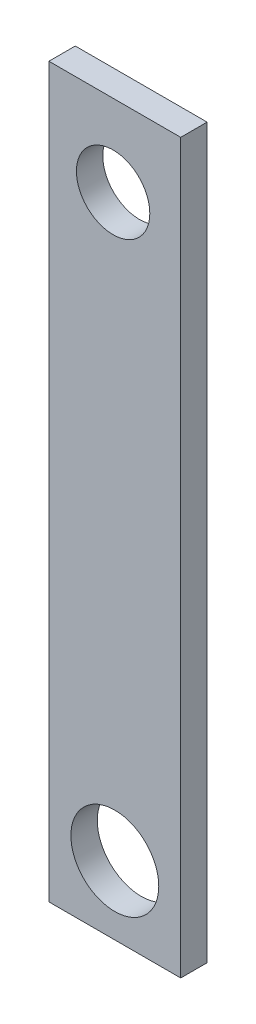
ISO-10303-21;
HEADER;
FILE_DESCRIPTION(('STEP AP214'),'2;1');
FILE_NAME('part.step','',(''),(''),'','','');
FILE_SCHEMA(('AUTOMOTIVE_DESIGN { 1 0 10303 214 1 1 1 1 }'));
ENDSEC;
DATA;
#1=APPLICATION_CONTEXT('core data for automotive mechanical design processes');
#2=APPLICATION_PROTOCOL_DEFINITION('international standard','automotive_design',2000,#1);
#3=PRODUCT_CONTEXT('',#1,'mechanical');
#4=PRODUCT('Part','Part','',(#3));
#5=PRODUCT_RELATED_PRODUCT_CATEGORY('part','',(#4));
#6=PRODUCT_DEFINITION_FORMATION('','',#4);
#7=PRODUCT_DEFINITION_CONTEXT('part definition',#1,'design');
#8=PRODUCT_DEFINITION('design','',#6,#7);
#9=PRODUCT_DEFINITION_SHAPE('','',#8);
#10=(LENGTH_UNIT() NAMED_UNIT(*) SI_UNIT(.MILLI.,.METRE.));
#11=(NAMED_UNIT(*) PLANE_ANGLE_UNIT() SI_UNIT($,.RADIAN.));
#12=(NAMED_UNIT(*) SI_UNIT($,.STERADIAN.) SOLID_ANGLE_UNIT());
#13=UNCERTAINTY_MEASURE_WITH_UNIT(LENGTH_MEASURE(1.E-05),#10,'distance_accuracy_value','');
#14=(GEOMETRIC_REPRESENTATION_CONTEXT(3) GLOBAL_UNCERTAINTY_ASSIGNED_CONTEXT((#13)) GLOBAL_UNIT_ASSIGNED_CONTEXT((#10,
#11,#12)) REPRESENTATION_CONTEXT('',''));
#15=CARTESIAN_POINT('',(0.,0.,0.));
#16=DIRECTION('',(0.,0.,1.));
#17=DIRECTION('',(1.,0.,0.));
#18=AXIS2_PLACEMENT_3D('',#15,#16,#17);
#19=CARTESIAN_POINT('',(0.,0.,3.));
#20=DIRECTION('',(0.,0.,1.));
#21=DIRECTION('',(1.,0.,0.));
#22=AXIS2_PLACEMENT_3D('',#19,#20,#21);
#23=PLANE('',#22);
#24=CARTESIAN_POINT('',(-11.25,-27.5,3.));
#25=DIRECTION('',(0.,0.,1.));
#26=DIRECTION('',(1.,0.,0.));
#27=AXIS2_PLACEMENT_3D('',#24,#25,#26);
#28=CIRCLE('',#27,4.17686671267305);
#29=CARTESIAN_POINT('',(-7.07313328732693,-27.5,3.));
#30=VERTEX_POINT('',#29);
#31=EDGE_CURVE('E100',#30,#30,#28,.T.);
#32=ORIENTED_EDGE('',*,*,#31,.F.);
#33=EDGE_LOOP('',(#32));
#34=FACE_BOUND('',#33,.T.);
#35=DIRECTION('',(0.,-1.,0.));
#36=VECTOR('',#35,1.);
#37=CARTESIAN_POINT('',(-18.5554144467521,-18.2319581289414,3.));
#38=LINE('',#37,#36);
#39=CARTESIAN_POINT('',(-18.5554144467521,-18.2319581289414,3.));
#40=VERTEX_POINT('',#39);
#41=CARTESIAN_POINT('',(-18.5554144467521,-101.083085073858,3.));
#42=VERTEX_POINT('',#41);
#43=EDGE_CURVE('E85',#40,#42,#38,.T.);
#44=ORIENTED_EDGE('',*,*,#43,.T.);
#45=DIRECTION('',(1.,0.,0.));
#46=VECTOR('',#45,1.);
#47=CARTESIAN_POINT('',(-18.5554144467521,-101.083085073858,3.));
#48=LINE('',#47,#46);
#49=CARTESIAN_POINT('',(-3.55541444675214,-101.083085073858,3.));
#50=VERTEX_POINT('',#49);
#51=EDGE_CURVE('E80',#42,#50,#48,.T.);
#52=ORIENTED_EDGE('',*,*,#51,.T.);
#53=DIRECTION('',(0.,1.,0.));
#54=VECTOR('',#53,1.);
#55=CARTESIAN_POINT('',(-3.55541444675215,-18.2319581289414,3.));
#56=LINE('',#55,#54);
#57=CARTESIAN_POINT('',(-3.55541444675215,-18.2319581289414,3.));
#58=VERTEX_POINT('',#57);
#59=EDGE_CURVE('E83',#50,#58,#56,.T.);
#60=ORIENTED_EDGE('',*,*,#59,.T.);
#61=DIRECTION('',(-1.,0.,0.));
#62=VECTOR('',#61,1.);
#63=CARTESIAN_POINT('',(-18.5554144467521,-18.2319581289414,3.));
#64=LINE('',#63,#62);
#65=EDGE_CURVE('E50',#58,#40,#64,.T.);
#66=ORIENTED_EDGE('',*,*,#65,.T.);
#67=EDGE_LOOP('',(#44,#52,#60,#66));
#68=FACE_BOUND('',#67,.T.);
#69=CARTESIAN_POINT('',(-11.0554144467521,-93.2869434703163,3.));
#70=DIRECTION('',(0.,0.,1.));
#71=DIRECTION('',(1.,0.,0.));
#72=AXIS2_PLACEMENT_3D('',#69,#70,#71);
#73=CIRCLE('',#72,5.);
#74=CARTESIAN_POINT('',(-6.05541444675214,-93.2869434703163,3.));
#75=VERTEX_POINT('',#74);
#76=EDGE_CURVE('E115',#75,#75,#73,.T.);
#77=ORIENTED_EDGE('',*,*,#76,.F.);
#78=EDGE_LOOP('',(#77));
#79=FACE_BOUND('',#78,.T.);
#80=ADVANCED_FACE('F33',(#34,#68,#79),#23,.T.);
#81=CARTESIAN_POINT('',(0.,0.,0.));
#82=DIRECTION('',(0.,0.,1.));
#83=DIRECTION('',(1.,0.,0.));
#84=AXIS2_PLACEMENT_3D('',#81,#82,#83);
#85=PLANE('',#84);
#86=DIRECTION('',(0.,-1.,0.));
#87=VECTOR('',#86,1.);
#88=CARTESIAN_POINT('',(-18.5554144467521,-18.2319581289414,0.));
#89=LINE('',#88,#87);
#90=CARTESIAN_POINT('',(-18.5554144467521,-18.2319581289414,0.));
#91=VERTEX_POINT('',#90);
#92=CARTESIAN_POINT('',(-18.5554144467521,-101.083085073858,0.));
#93=VERTEX_POINT('',#92);
#94=EDGE_CURVE('E97',#91,#93,#89,.T.);
#95=ORIENTED_EDGE('',*,*,#94,.F.);
#96=DIRECTION('',(-1.,0.,0.));
#97=VECTOR('',#96,1.);
#98=CARTESIAN_POINT('',(-18.5554144467521,-18.2319581289414,0.));
#99=LINE('',#98,#97);
#100=CARTESIAN_POINT('',(-3.55541444675215,-18.2319581289414,0.));
#101=VERTEX_POINT('',#100);
#102=EDGE_CURVE('E73',#101,#91,#99,.T.);
#103=ORIENTED_EDGE('',*,*,#102,.F.);
#104=DIRECTION('',(0.,1.,0.));
#105=VECTOR('',#104,1.);
#106=CARTESIAN_POINT('',(-3.55541444675215,-18.2319581289414,0.));
#107=LINE('',#106,#105);
#108=CARTESIAN_POINT('',(-3.55541444675214,-101.083085073858,0.));
#109=VERTEX_POINT('',#108);
#110=EDGE_CURVE('E67',#109,#101,#107,.T.);
#111=ORIENTED_EDGE('',*,*,#110,.F.);
#112=DIRECTION('',(1.,0.,0.));
#113=VECTOR('',#112,1.);
#114=CARTESIAN_POINT('',(-18.5554144467521,-101.083085073858,0.));
#115=LINE('',#114,#113);
#116=EDGE_CURVE('E89',#93,#109,#115,.T.);
#117=ORIENTED_EDGE('',*,*,#116,.F.);
#118=EDGE_LOOP('',(#95,#103,#111,#117));
#119=FACE_BOUND('',#118,.T.);
#120=CARTESIAN_POINT('',(-11.25,-27.5,0.));
#121=DIRECTION('',(0.,0.,1.));
#122=DIRECTION('',(1.,0.,0.));
#123=AXIS2_PLACEMENT_3D('',#120,#121,#122);
#124=CIRCLE('',#123,4.17686671267305);
#125=CARTESIAN_POINT('',(-7.07313328732693,-27.5,0.));
#126=VERTEX_POINT('',#125);
#127=EDGE_CURVE('E112',#126,#126,#124,.T.);
#128=ORIENTED_EDGE('',*,*,#127,.T.);
#129=EDGE_LOOP('',(#128));
#130=FACE_BOUND('',#129,.T.);
#131=CARTESIAN_POINT('',(-11.0554144467521,-93.2869434703163,0.));
#132=DIRECTION('',(0.,0.,1.));
#133=DIRECTION('',(1.,0.,0.));
#134=AXIS2_PLACEMENT_3D('',#131,#132,#133);
#135=CIRCLE('',#134,5.);
#136=CARTESIAN_POINT('',(-6.05541444675214,-93.2869434703163,0.));
#137=VERTEX_POINT('',#136);
#138=EDGE_CURVE('E118',#137,#137,#135,.T.);
#139=ORIENTED_EDGE('',*,*,#138,.T.);
#140=EDGE_LOOP('',(#139));
#141=FACE_BOUND('',#140,.T.);
#142=ADVANCED_FACE('F108',(#119,#130,#141),#85,.F.);
#143=CARTESIAN_POINT('',(-18.5554144467521,-18.2319581289414,3.));
#144=DIRECTION('',(1.,0.,0.));
#145=DIRECTION('',(0.,0.,-1.));
#146=AXIS2_PLACEMENT_3D('',#143,#144,#145);
#147=PLANE('',#146);
#148=ORIENTED_EDGE('',*,*,#94,.T.);
#149=DIRECTION('',(0.,0.,-1.));
#150=VECTOR('',#149,1.);
#151=CARTESIAN_POINT('',(-18.5554144467521,-101.083085073858,3.));
#152=LINE('',#151,#150);
#153=EDGE_CURVE('E11',#42,#93,#152,.T.);
#154=ORIENTED_EDGE('',*,*,#153,.F.);
#155=ORIENTED_EDGE('',*,*,#43,.F.);
#156=DIRECTION('',(0.,0.,-1.));
#157=VECTOR('',#156,1.);
#158=CARTESIAN_POINT('',(-18.5554144467521,-18.2319581289414,3.));
#159=LINE('',#158,#157);
#160=EDGE_CURVE('E93',#40,#91,#159,.T.);
#161=ORIENTED_EDGE('',*,*,#160,.T.);
#162=EDGE_LOOP('',(#148,#154,#155,#161));
#163=FACE_BOUND('',#162,.T.);
#164=ADVANCED_FACE('F35',(#163),#147,.F.);
#165=CARTESIAN_POINT('',(-18.5554144467521,-101.083085073858,3.));
#166=DIRECTION('',(0.,1.,0.));
#167=DIRECTION('',(0.,0.,1.));
#168=AXIS2_PLACEMENT_3D('',#165,#166,#167);
#169=PLANE('',#168);
#170=ORIENTED_EDGE('',*,*,#116,.T.);
#171=DIRECTION('',(0.,0.,-1.));
#172=VECTOR('',#171,1.);
#173=CARTESIAN_POINT('',(-3.55541444675214,-101.083085073858,3.));
#174=LINE('',#173,#172);
#175=EDGE_CURVE('E42',#50,#109,#174,.T.);
#176=ORIENTED_EDGE('',*,*,#175,.F.);
#177=ORIENTED_EDGE('',*,*,#51,.F.);
#178=ORIENTED_EDGE('',*,*,#153,.T.);
#179=EDGE_LOOP('',(#170,#176,#177,#178));
#180=FACE_BOUND('',#179,.T.);
#181=ADVANCED_FACE('F88',(#180),#169,.F.);
#182=CARTESIAN_POINT('',(-3.55541444675215,-18.2319581289414,3.));
#183=DIRECTION('',(-1.,0.,0.));
#184=DIRECTION('',(0.,-1.,0.));
#185=AXIS2_PLACEMENT_3D('',#182,#183,#184);
#186=PLANE('',#185);
#187=ORIENTED_EDGE('',*,*,#110,.T.);
#188=DIRECTION('',(0.,0.,-1.));
#189=VECTOR('',#188,1.);
#190=CARTESIAN_POINT('',(-3.55541444675215,-18.2319581289414,3.));
#191=LINE('',#190,#189);
#192=EDGE_CURVE('E90',#58,#101,#191,.T.);
#193=ORIENTED_EDGE('',*,*,#192,.F.);
#194=ORIENTED_EDGE('',*,*,#59,.F.);
#195=ORIENTED_EDGE('',*,*,#175,.T.);
#196=EDGE_LOOP('',(#187,#193,#194,#195));
#197=FACE_BOUND('',#196,.T.);
#198=ADVANCED_FACE('F91',(#197),#186,.F.);
#199=CARTESIAN_POINT('',(-18.5554144467521,-18.2319581289414,3.));
#200=DIRECTION('',(0.,-1.,0.));
#201=DIRECTION('',(0.,0.,-1.));
#202=AXIS2_PLACEMENT_3D('',#199,#200,#201);
#203=PLANE('',#202);
#204=ORIENTED_EDGE('',*,*,#102,.T.);
#205=ORIENTED_EDGE('',*,*,#160,.F.);
#206=ORIENTED_EDGE('',*,*,#65,.F.);
#207=ORIENTED_EDGE('',*,*,#192,.T.);
#208=EDGE_LOOP('',(#204,#205,#206,#207));
#209=FACE_BOUND('',#208,.T.);
#210=ADVANCED_FACE('F105',(#209),#203,.F.);
#211=CARTESIAN_POINT('',(-11.25,-27.5,3.));
#212=DIRECTION('',(0.,0.,-1.));
#213=DIRECTION('',(-1.,0.,0.));
#214=AXIS2_PLACEMENT_3D('',#211,#212,#213);
#215=CYLINDRICAL_SURFACE('',#214,4.17686671267305);
#216=ORIENTED_EDGE('',*,*,#31,.T.);
#217=EDGE_LOOP('',(#216));
#218=FACE_BOUND('',#217,.T.);
#219=ORIENTED_EDGE('',*,*,#127,.F.);
#220=EDGE_LOOP('',(#219));
#221=FACE_BOUND('',#220,.T.);
#222=ADVANCED_FACE('F135',(#218,#221),#215,.F.);
#223=CARTESIAN_POINT('',(-11.0554144467521,-93.2869434703163,3.));
#224=DIRECTION('',(0.,0.,-1.));
#225=DIRECTION('',(-1.,0.,0.));
#226=AXIS2_PLACEMENT_3D('',#223,#224,#225);
#227=CYLINDRICAL_SURFACE('',#226,5.);
#228=ORIENTED_EDGE('',*,*,#76,.T.);
#229=EDGE_LOOP('',(#228));
#230=FACE_BOUND('',#229,.T.);
#231=ORIENTED_EDGE('',*,*,#138,.F.);
#232=EDGE_LOOP('',(#231));
#233=FACE_BOUND('',#232,.T.);
#234=ADVANCED_FACE('F124',(#230,#233),#227,.F.);
#235=CLOSED_SHELL('',(#80,#142,#164,#181,#198,#210,#222,#234));
#236=MANIFOLD_SOLID_BREP('B2',#235);
#237=ADVANCED_BREP_SHAPE_REPRESENTATION('',(#18,#236),#14);
#238=SHAPE_DEFINITION_REPRESENTATION(#9,#237);
ENDSEC;
END-ISO-10303-21;
